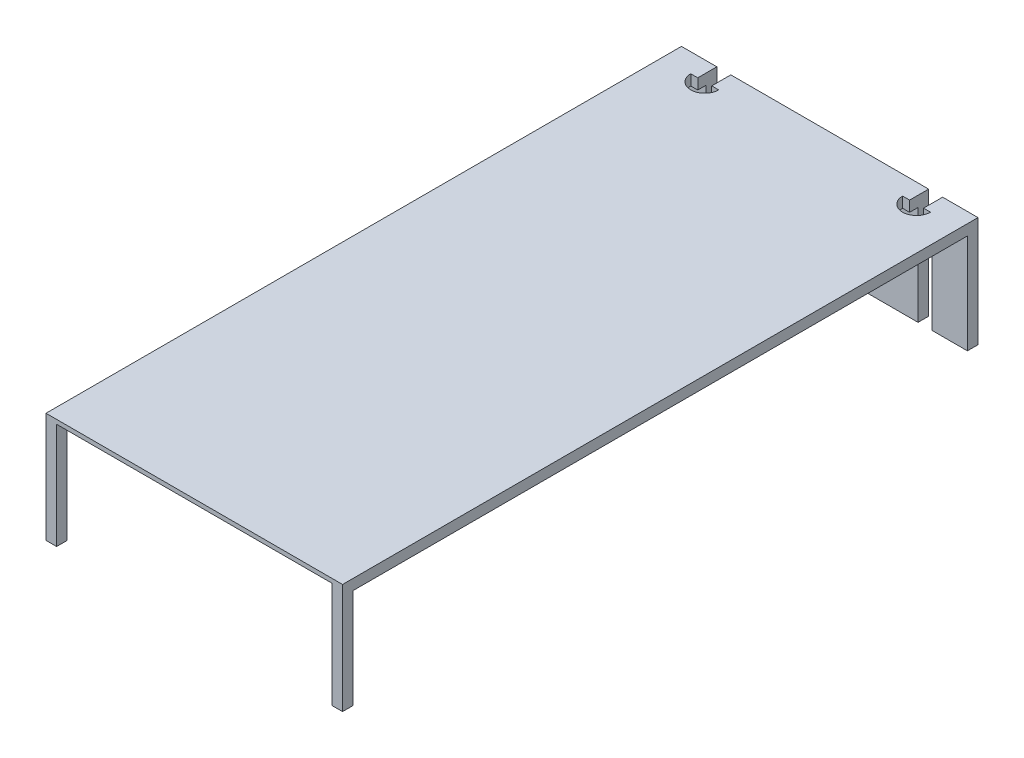
ISO-10303-21;
HEADER;
FILE_DESCRIPTION(('STEP AP214'),'2;1');
FILE_NAME('part.step','',(''),(''),'','','');
FILE_SCHEMA(('AUTOMOTIVE_DESIGN { 1 0 10303 214 1 1 1 1 }'));
ENDSEC;
DATA;
#1=APPLICATION_CONTEXT('core data for automotive mechanical design processes');
#2=APPLICATION_PROTOCOL_DEFINITION('international standard','automotive_design',2000,#1);
#3=PRODUCT_CONTEXT('',#1,'mechanical');
#4=PRODUCT('Part','Part','',(#3));
#5=PRODUCT_RELATED_PRODUCT_CATEGORY('part','',(#4));
#6=PRODUCT_DEFINITION_FORMATION('','',#4);
#7=PRODUCT_DEFINITION_CONTEXT('part definition',#1,'design');
#8=PRODUCT_DEFINITION('design','',#6,#7);
#9=PRODUCT_DEFINITION_SHAPE('','',#8);
#10=(LENGTH_UNIT() NAMED_UNIT(*) SI_UNIT(.MILLI.,.METRE.));
#11=(NAMED_UNIT(*) PLANE_ANGLE_UNIT() SI_UNIT($,.RADIAN.));
#12=(NAMED_UNIT(*) SI_UNIT($,.STERADIAN.) SOLID_ANGLE_UNIT());
#13=UNCERTAINTY_MEASURE_WITH_UNIT(LENGTH_MEASURE(1.E-05),#10,'distance_accuracy_value','');
#14=(GEOMETRIC_REPRESENTATION_CONTEXT(3) GLOBAL_UNCERTAINTY_ASSIGNED_CONTEXT((#13)) GLOBAL_UNIT_ASSIGNED_CONTEXT((#10,
#11,#12)) REPRESENTATION_CONTEXT('',''));
#15=CARTESIAN_POINT('',(0.,0.,0.));
#16=DIRECTION('',(0.,0.,1.));
#17=DIRECTION('',(1.,0.,0.));
#18=AXIS2_PLACEMENT_3D('',#15,#16,#17);
#19=CARTESIAN_POINT('',(0.,0.,0.));
#20=DIRECTION('',(0.,1.,0.));
#21=DIRECTION('',(0.,0.,1.));
#22=AXIS2_PLACEMENT_3D('',#19,#20,#21);
#23=PLANE('',#22);
#24=DIRECTION('',(0.,0.,-1.));
#25=VECTOR('',#24,1.);
#26=CARTESIAN_POINT('',(-32.5,0.,75.000012));
#27=LINE('',#26,#25);
#28=CARTESIAN_POINT('',(-32.5,0.,75.));
#29=VERTEX_POINT('',#28);
#30=CARTESIAN_POINT('',(-32.5,0.,72.5));
#31=VERTEX_POINT('',#30);
#32=EDGE_CURVE('E277',#29,#31,#27,.T.);
#33=ORIENTED_EDGE('',*,*,#32,.F.);
#34=DIRECTION('',(1.,0.,0.));
#35=VECTOR('',#34,1.);
#36=CARTESIAN_POINT('',(0.,0.,75.));
#37=LINE('',#36,#35);
#38=CARTESIAN_POINT('',(-35.,0.,75.));
#39=VERTEX_POINT('',#38);
#40=EDGE_CURVE('E451',#39,#29,#37,.T.);
#41=ORIENTED_EDGE('',*,*,#40,.F.);
#42=DIRECTION('',(0.,0.,1.));
#43=VECTOR('',#42,1.);
#44=CARTESIAN_POINT('',(-35.,0.,0.));
#45=LINE('',#44,#43);
#46=CARTESIAN_POINT('',(-35.,0.,72.5));
#47=VERTEX_POINT('',#46);
#48=EDGE_CURVE('E450',#47,#39,#45,.T.);
#49=ORIENTED_EDGE('',*,*,#48,.F.);
#50=DIRECTION('',(1.,0.,0.));
#51=VECTOR('',#50,1.);
#52=CARTESIAN_POINT('',(-35.,0.,72.5));
#53=LINE('',#52,#51);
#54=EDGE_CURVE('E316',#47,#31,#53,.T.);
#55=ORIENTED_EDGE('',*,*,#54,.T.);
#56=EDGE_LOOP('',(#33,#41,#49,#55));
#57=FACE_BOUND('',#56,.T.);
#58=ADVANCED_FACE('F47',(#57),#23,.F.);
#59=DIRECTION('',(0.,0.,-1.));
#60=VECTOR('',#59,1.);
#61=CARTESIAN_POINT('',(32.5,0.,75.000012));
#62=LINE('',#61,#60);
#63=CARTESIAN_POINT('',(32.5,0.,75.));
#64=VERTEX_POINT('',#63);
#65=CARTESIAN_POINT('',(32.5,0.,72.5));
#66=VERTEX_POINT('',#65);
#67=EDGE_CURVE('E253',#64,#66,#62,.T.);
#68=ORIENTED_EDGE('',*,*,#67,.T.);
#69=CARTESIAN_POINT('',(35.,0.,72.5));
#70=VERTEX_POINT('',#69);
#71=EDGE_CURVE('E300',#66,#70,#53,.T.);
#72=ORIENTED_EDGE('',*,*,#71,.T.);
#73=DIRECTION('',(0.,0.,1.));
#74=VECTOR('',#73,1.);
#75=CARTESIAN_POINT('',(35.,0.,0.));
#76=LINE('',#75,#74);
#77=CARTESIAN_POINT('',(35.,0.,75.));
#78=VERTEX_POINT('',#77);
#79=EDGE_CURVE('E455',#70,#78,#76,.T.);
#80=ORIENTED_EDGE('',*,*,#79,.T.);
#81=EDGE_CURVE('E449',#64,#78,#37,.T.);
#82=ORIENTED_EDGE('',*,*,#81,.F.);
#83=EDGE_LOOP('',(#68,#72,#80,#82));
#84=FACE_BOUND('',#83,.T.);
#85=ADVANCED_FACE('F559',(#84),#23,.F.);
#86=CARTESIAN_POINT('',(0.,26.,75.));
#87=DIRECTION('',(0.,0.,-1.));
#88=DIRECTION('',(-1.,0.,0.));
#89=AXIS2_PLACEMENT_3D('',#86,#87,#88);
#90=PLANE('',#89);
#91=DIRECTION('',(0.,-1.,0.));
#92=VECTOR('',#91,1.);
#93=CARTESIAN_POINT('',(-32.5,26.,75.));
#94=LINE('',#93,#92);
#95=CARTESIAN_POINT('',(-32.5,25.,75.));
#96=VERTEX_POINT('',#95);
#97=EDGE_CURVE('E287',#96,#29,#94,.T.);
#98=ORIENTED_EDGE('',*,*,#97,.F.);
#99=DIRECTION('',(-1.,0.,0.));
#100=VECTOR('',#99,1.);
#101=CARTESIAN_POINT('',(0.,25.,75.));
#102=LINE('',#101,#100);
#103=CARTESIAN_POINT('',(32.5,25.,75.));
#104=VERTEX_POINT('',#103);
#105=EDGE_CURVE('E11',#104,#96,#102,.T.);
#106=ORIENTED_EDGE('',*,*,#105,.F.);
#107=DIRECTION('',(0.,1.,0.));
#108=VECTOR('',#107,1.);
#109=CARTESIAN_POINT('',(32.5,26.,75.));
#110=LINE('',#109,#108);
#111=EDGE_CURVE('E248',#64,#104,#110,.T.);
#112=ORIENTED_EDGE('',*,*,#111,.F.);
#113=ORIENTED_EDGE('',*,*,#81,.T.);
#114=DIRECTION('',(0.,-1.,0.));
#115=VECTOR('',#114,1.);
#116=CARTESIAN_POINT('',(35.,26.,75.));
#117=LINE('',#116,#115);
#118=CARTESIAN_POINT('',(35.,26.,75.));
#119=VERTEX_POINT('',#118);
#120=EDGE_CURVE('E472',#119,#78,#117,.T.);
#121=ORIENTED_EDGE('',*,*,#120,.F.);
#122=DIRECTION('',(1.,0.,0.));
#123=VECTOR('',#122,1.);
#124=CARTESIAN_POINT('',(0.,26.,75.));
#125=LINE('',#124,#123);
#126=CARTESIAN_POINT('',(-35.,26.,75.));
#127=VERTEX_POINT('',#126);
#128=EDGE_CURVE('E419',#127,#119,#125,.T.);
#129=ORIENTED_EDGE('',*,*,#128,.F.);
#130=DIRECTION('',(0.,-1.,0.));
#131=VECTOR('',#130,1.);
#132=CARTESIAN_POINT('',(-35.,26.,75.));
#133=LINE('',#132,#131);
#134=EDGE_CURVE('E476',#127,#39,#133,.T.);
#135=ORIENTED_EDGE('',*,*,#134,.T.);
#136=ORIENTED_EDGE('',*,*,#40,.T.);
#137=EDGE_LOOP('',(#98,#106,#112,#113,#121,#129,#135,#136));
#138=FACE_BOUND('',#137,.T.);
#139=ADVANCED_FACE('F574',(#138),#90,.F.);
#140=CARTESIAN_POINT('',(-35.,23.5,72.5));
#141=DIRECTION('',(0.,1.,0.));
#142=DIRECTION('',(0.,0.,1.));
#143=AXIS2_PLACEMENT_3D('',#140,#141,#142);
#144=PLANE('',#143);
#145=DIRECTION('',(0.,0.,-1.));
#146=VECTOR('',#145,1.);
#147=CARTESIAN_POINT('',(-32.5,23.5,72.5));
#148=LINE('',#147,#146);
#149=CARTESIAN_POINT('',(-32.5,23.5,72.5));
#150=VERTEX_POINT('',#149);
#151=CARTESIAN_POINT('',(-32.5,23.5,49.));
#152=VERTEX_POINT('',#151);
#153=EDGE_CURVE('E284',#150,#152,#148,.T.);
#154=ORIENTED_EDGE('',*,*,#153,.F.);
#155=DIRECTION('',(1.,0.,0.));
#156=VECTOR('',#155,1.);
#157=CARTESIAN_POINT('',(-35.,23.5,72.5));
#158=LINE('',#157,#156);
#159=CARTESIAN_POINT('',(-35.,23.5,72.5));
#160=VERTEX_POINT('',#159);
#161=EDGE_CURVE('E301',#160,#150,#158,.T.);
#162=ORIENTED_EDGE('',*,*,#161,.F.);
#163=DIRECTION('',(0.,0.,1.));
#164=VECTOR('',#163,1.);
#165=CARTESIAN_POINT('',(-35.,23.5,72.5));
#166=LINE('',#165,#164);
#167=CARTESIAN_POINT('',(-35.,23.5,-72.5));
#168=VERTEX_POINT('',#167);
#169=EDGE_CURVE('E296',#168,#160,#166,.T.);
#170=ORIENTED_EDGE('',*,*,#169,.F.);
#171=DIRECTION('',(1.,0.,0.));
#172=VECTOR('',#171,1.);
#173=CARTESIAN_POINT('',(-35.,23.5,-72.5));
#174=LINE('',#173,#172);
#175=CARTESIAN_POINT('',(-26.65,23.5,-72.5));
#176=VERTEX_POINT('',#175);
#177=EDGE_CURVE('E307',#168,#176,#174,.T.);
#178=ORIENTED_EDGE('',*,*,#177,.T.);
#179=DIRECTION('',(0.,0.,1.));
#180=VECTOR('',#179,1.);
#181=CARTESIAN_POINT('',(-26.6500000000001,23.5,0.));
#182=LINE('',#181,#180);
#183=CARTESIAN_POINT('',(-26.65,23.5,-70.5));
#184=VERTEX_POINT('',#183);
#185=EDGE_CURVE('E360',#176,#184,#182,.T.);
#186=ORIENTED_EDGE('',*,*,#185,.T.);
#187=DIRECTION('',(-1.,0.,0.));
#188=VECTOR('',#187,1.);
#189=CARTESIAN_POINT('',(0.,23.5,-70.5));
#190=LINE('',#189,#188);
#191=CARTESIAN_POINT('',(-28.3,23.5,-70.5));
#192=VERTEX_POINT('',#191);
#193=EDGE_CURVE('E363',#184,#192,#190,.T.);
#194=ORIENTED_EDGE('',*,*,#193,.T.);
#195=CARTESIAN_POINT('',(-25.,23.5,-70.5));
#196=DIRECTION('',(0.,1.,0.));
#197=DIRECTION('',(0.,0.,1.));
#198=AXIS2_PLACEMENT_3D('',#195,#196,#197);
#199=CIRCLE('',#198,3.3);
#200=CARTESIAN_POINT('',(-21.7,23.5,-70.5));
#201=VERTEX_POINT('',#200);
#202=EDGE_CURVE('E366',#192,#201,#199,.T.);
#203=ORIENTED_EDGE('',*,*,#202,.T.);
#204=DIRECTION('',(-1.,0.,0.));
#205=VECTOR('',#204,1.);
#206=CARTESIAN_POINT('',(0.,23.5,-70.5));
#207=LINE('',#206,#205);
#208=CARTESIAN_POINT('',(-23.35,23.5,-70.5));
#209=VERTEX_POINT('',#208);
#210=EDGE_CURVE('E369',#201,#209,#207,.T.);
#211=ORIENTED_EDGE('',*,*,#210,.T.);
#212=DIRECTION('',(0.,0.,-1.));
#213=VECTOR('',#212,1.);
#214=CARTESIAN_POINT('',(-23.35,23.5,0.));
#215=LINE('',#214,#213);
#216=CARTESIAN_POINT('',(-23.35,23.5,-72.5));
#217=VERTEX_POINT('',#216);
#218=EDGE_CURVE('E372',#209,#217,#215,.T.);
#219=ORIENTED_EDGE('',*,*,#218,.T.);
#220=CARTESIAN_POINT('',(23.35,23.5,-72.5));
#221=VERTEX_POINT('',#220);
#222=EDGE_CURVE('E311',#217,#221,#174,.T.);
#223=ORIENTED_EDGE('',*,*,#222,.T.);
#224=DIRECTION('',(0.,0.,-1.));
#225=VECTOR('',#224,1.);
#226=CARTESIAN_POINT('',(23.35,23.5,0.));
#227=LINE('',#226,#225);
#228=CARTESIAN_POINT('',(23.35,23.5,-70.5));
#229=VERTEX_POINT('',#228);
#230=EDGE_CURVE('E352',#229,#221,#227,.T.);
#231=ORIENTED_EDGE('',*,*,#230,.F.);
#232=DIRECTION('',(1.,0.,0.));
#233=VECTOR('',#232,1.);
#234=CARTESIAN_POINT('',(0.,23.5,-70.5));
#235=LINE('',#234,#233);
#236=CARTESIAN_POINT('',(21.7,23.5,-70.5));
#237=VERTEX_POINT('',#236);
#238=EDGE_CURVE('E348',#237,#229,#235,.T.);
#239=ORIENTED_EDGE('',*,*,#238,.F.);
#240=CARTESIAN_POINT('',(25.,23.5,-70.5));
#241=DIRECTION('',(0.,1.,0.));
#242=DIRECTION('',(0.,0.,1.));
#243=AXIS2_PLACEMENT_3D('',#240,#241,#242);
#244=CIRCLE('',#243,3.3);
#245=CARTESIAN_POINT('',(28.3,23.5,-70.5));
#246=VERTEX_POINT('',#245);
#247=EDGE_CURVE('E344',#246,#237,#244,.F.);
#248=ORIENTED_EDGE('',*,*,#247,.F.);
#249=DIRECTION('',(1.,0.,0.));
#250=VECTOR('',#249,1.);
#251=CARTESIAN_POINT('',(0.,23.5,-70.5));
#252=LINE('',#251,#250);
#253=CARTESIAN_POINT('',(26.65,23.5,-70.5));
#254=VERTEX_POINT('',#253);
#255=EDGE_CURVE('E340',#254,#246,#252,.T.);
#256=ORIENTED_EDGE('',*,*,#255,.F.);
#257=DIRECTION('',(0.,0.,1.));
#258=VECTOR('',#257,1.);
#259=CARTESIAN_POINT('',(26.6500000000001,23.5,0.));
#260=LINE('',#259,#258);
#261=CARTESIAN_POINT('',(26.65,23.5,-72.5));
#262=VERTEX_POINT('',#261);
#263=EDGE_CURVE('E527',#262,#254,#260,.T.);
#264=ORIENTED_EDGE('',*,*,#263,.F.);
#265=CARTESIAN_POINT('',(35.,23.5,-72.5));
#266=VERTEX_POINT('',#265);
#267=EDGE_CURVE('E312',#262,#266,#174,.T.);
#268=ORIENTED_EDGE('',*,*,#267,.T.);
#269=DIRECTION('',(0.,0.,1.));
#270=VECTOR('',#269,1.);
#271=CARTESIAN_POINT('',(35.,23.5,0.));
#272=LINE('',#271,#270);
#273=CARTESIAN_POINT('',(35.,23.5,72.5));
#274=VERTEX_POINT('',#273);
#275=EDGE_CURVE('E356',#266,#274,#272,.T.);
#276=ORIENTED_EDGE('',*,*,#275,.T.);
#277=CARTESIAN_POINT('',(32.5,23.5,72.5));
#278=VERTEX_POINT('',#277);
#279=EDGE_CURVE('E306',#278,#274,#158,.T.);
#280=ORIENTED_EDGE('',*,*,#279,.F.);
#281=DIRECTION('',(0.,0.,1.));
#282=VECTOR('',#281,1.);
#283=CARTESIAN_POINT('',(32.5,23.5,72.5));
#284=LINE('',#283,#282);
#285=CARTESIAN_POINT('',(32.5,23.5,49.));
#286=VERTEX_POINT('',#285);
#287=EDGE_CURVE('E63',#286,#278,#284,.T.);
#288=ORIENTED_EDGE('',*,*,#287,.F.);
#289=DIRECTION('',(1.,0.,0.));
#290=VECTOR('',#289,1.);
#291=CARTESIAN_POINT('',(-35.,23.5,49.));
#292=LINE('',#291,#290);
#293=EDGE_CURVE('E56',#152,#286,#292,.T.);
#294=ORIENTED_EDGE('',*,*,#293,.F.);
#295=EDGE_LOOP('',(#154,#162,#170,#178,#186,#194,#203,#211,#219,#223,#231,#239,#248,#256,#264,
#268,#276,#280,#288,#294));
#296=FACE_BOUND('',#295,.T.);
#297=ADVANCED_FACE('F581',(#296),#144,.F.);
#298=CARTESIAN_POINT('',(-35.,23.5,72.5));
#299=DIRECTION('',(0.,0.,1.));
#300=DIRECTION('',(1.,0.,0.));
#301=AXIS2_PLACEMENT_3D('',#298,#299,#300);
#302=PLANE('',#301);
#303=DIRECTION('',(0.,1.,0.));
#304=VECTOR('',#303,1.);
#305=CARTESIAN_POINT('',(-32.5,23.5,72.5));
#306=LINE('',#305,#304);
#307=EDGE_CURVE('E534',#31,#150,#306,.T.);
#308=ORIENTED_EDGE('',*,*,#307,.F.);
#309=ORIENTED_EDGE('',*,*,#54,.F.);
#310=DIRECTION('',(0.,-1.,0.));
#311=VECTOR('',#310,1.);
#312=CARTESIAN_POINT('',(-35.,23.5,72.5));
#313=LINE('',#312,#311);
#314=EDGE_CURVE('E290',#160,#47,#313,.T.);
#315=ORIENTED_EDGE('',*,*,#314,.F.);
#316=ORIENTED_EDGE('',*,*,#161,.T.);
#317=EDGE_LOOP('',(#308,#309,#315,#316));
#318=FACE_BOUND('',#317,.T.);
#319=ADVANCED_FACE('F607',(#318),#302,.F.);
#320=DIRECTION('',(0.,-1.,0.));
#321=VECTOR('',#320,1.);
#322=CARTESIAN_POINT('',(32.5,23.5,72.5));
#323=LINE('',#322,#321);
#324=EDGE_CURVE('E531',#278,#66,#323,.T.);
#325=ORIENTED_EDGE('',*,*,#324,.F.);
#326=ORIENTED_EDGE('',*,*,#279,.T.);
#327=DIRECTION('',(0.,-1.,0.));
#328=VECTOR('',#327,1.);
#329=CARTESIAN_POINT('',(35.,26.,72.5));
#330=LINE('',#329,#328);
#331=EDGE_CURVE('E336',#274,#70,#330,.T.);
#332=ORIENTED_EDGE('',*,*,#331,.T.);
#333=ORIENTED_EDGE('',*,*,#71,.F.);
#334=EDGE_LOOP('',(#325,#326,#332,#333));
#335=FACE_BOUND('',#334,.T.);
#336=ADVANCED_FACE('F564',(#335),#302,.F.);
#337=CARTESIAN_POINT('',(35.,0.,-75.));
#338=VERTEX_POINT('',#337);
#339=CARTESIAN_POINT('',(35.,0.,-72.5));
#340=VERTEX_POINT('',#339);
#341=EDGE_CURVE('E456',#338,#340,#76,.T.);
#342=ORIENTED_EDGE('',*,*,#341,.T.);
#343=DIRECTION('',(-1.,0.,0.));
#344=VECTOR('',#343,1.);
#345=CARTESIAN_POINT('',(0.,0.,-72.5));
#346=LINE('',#345,#344);
#347=CARTESIAN_POINT('',(26.65,0.,-72.5));
#348=VERTEX_POINT('',#347);
#349=EDGE_CURVE('E523',#340,#348,#346,.T.);
#350=ORIENTED_EDGE('',*,*,#349,.T.);
#351=DIRECTION('',(0.,0.,1.));
#352=VECTOR('',#351,1.);
#353=CARTESIAN_POINT('',(26.6500000000001,0.,0.));
#354=LINE('',#353,#352);
#355=CARTESIAN_POINT('',(26.65,0.,-75.));
#356=VERTEX_POINT('',#355);
#357=EDGE_CURVE('E381',#356,#348,#354,.T.);
#358=ORIENTED_EDGE('',*,*,#357,.F.);
#359=DIRECTION('',(1.,0.,0.));
#360=VECTOR('',#359,1.);
#361=CARTESIAN_POINT('',(0.,0.,-75.));
#362=LINE('',#361,#360);
#363=EDGE_CURVE('E437',#356,#338,#362,.T.);
#364=ORIENTED_EDGE('',*,*,#363,.T.);
#365=EDGE_LOOP('',(#342,#350,#358,#364));
#366=FACE_BOUND('',#365,.T.);
#367=ADVANCED_FACE('F587',(#366),#23,.F.);
#368=DIRECTION('',(0.,0.,-1.));
#369=VECTOR('',#368,1.);
#370=CARTESIAN_POINT('',(23.35,0.,0.));
#371=LINE('',#370,#369);
#372=CARTESIAN_POINT('',(23.35,0.,-72.5));
#373=VERTEX_POINT('',#372);
#374=CARTESIAN_POINT('',(23.35,0.,-75.));
#375=VERTEX_POINT('',#374);
#376=EDGE_CURVE('E375',#373,#375,#371,.T.);
#377=ORIENTED_EDGE('',*,*,#376,.F.);
#378=CARTESIAN_POINT('',(-23.35,0.,-72.5));
#379=VERTEX_POINT('',#378);
#380=EDGE_CURVE('E522',#373,#379,#346,.T.);
#381=ORIENTED_EDGE('',*,*,#380,.T.);
#382=DIRECTION('',(0.,0.,-1.));
#383=VECTOR('',#382,1.);
#384=CARTESIAN_POINT('',(-23.35,0.,0.));
#385=LINE('',#384,#383);
#386=CARTESIAN_POINT('',(-23.35,0.,-75.));
#387=VERTEX_POINT('',#386);
#388=EDGE_CURVE('E436',#379,#387,#385,.T.);
#389=ORIENTED_EDGE('',*,*,#388,.T.);
#390=EDGE_CURVE('E432',#387,#375,#362,.T.);
#391=ORIENTED_EDGE('',*,*,#390,.T.);
#392=EDGE_LOOP('',(#377,#381,#389,#391));
#393=FACE_BOUND('',#392,.T.);
#394=ADVANCED_FACE('F643',(#393),#23,.F.);
#395=CARTESIAN_POINT('',(0.,26.,-70.5));
#396=DIRECTION('',(0.,0.,-1.));
#397=DIRECTION('',(-1.,0.,0.));
#398=AXIS2_PLACEMENT_3D('',#395,#396,#397);
#399=PLANE('',#398);
#400=DIRECTION('',(0.,-1.,0.));
#401=VECTOR('',#400,1.);
#402=CARTESIAN_POINT('',(26.65,26.,-70.5));
#403=LINE('',#402,#401);
#404=CARTESIAN_POINT('',(26.65,26.,-70.5));
#405=VERTEX_POINT('',#404);
#406=EDGE_CURVE('E429',#405,#254,#403,.T.);
#407=ORIENTED_EDGE('',*,*,#406,.T.);
#408=ORIENTED_EDGE('',*,*,#255,.T.);
#409=DIRECTION('',(0.,-1.,0.));
#410=VECTOR('',#409,1.);
#411=CARTESIAN_POINT('',(28.3,26.,-70.5));
#412=LINE('',#411,#410);
#413=CARTESIAN_POINT('',(28.3,26.,-70.5));
#414=VERTEX_POINT('',#413);
#415=EDGE_CURVE('E518',#414,#246,#412,.T.);
#416=ORIENTED_EDGE('',*,*,#415,.F.);
#417=DIRECTION('',(1.,0.,0.));
#418=VECTOR('',#417,1.);
#419=CARTESIAN_POINT('',(0.,26.,-70.5));
#420=LINE('',#419,#418);
#421=EDGE_CURVE('E376',#405,#414,#420,.T.);
#422=ORIENTED_EDGE('',*,*,#421,.F.);
#423=EDGE_LOOP('',(#407,#408,#416,#422));
#424=FACE_BOUND('',#423,.T.);
#425=ADVANCED_FACE('F49',(#424),#399,.F.);
#426=CARTESIAN_POINT('',(25.,26.,-70.5));
#427=DIRECTION('',(0.,-1.,0.));
#428=DIRECTION('',(0.,0.,-1.));
#429=AXIS2_PLACEMENT_3D('',#426,#427,#428);
#430=CYLINDRICAL_SURFACE('',#429,3.3);
#431=ORIENTED_EDGE('',*,*,#415,.T.);
#432=ORIENTED_EDGE('',*,*,#247,.T.);
#433=DIRECTION('',(0.,-1.,0.));
#434=VECTOR('',#433,1.);
#435=CARTESIAN_POINT('',(21.7,26.,-70.5));
#436=LINE('',#435,#434);
#437=CARTESIAN_POINT('',(21.7,26.,-70.5));
#438=VERTEX_POINT('',#437);
#439=EDGE_CURVE('E514',#438,#237,#436,.T.);
#440=ORIENTED_EDGE('',*,*,#439,.F.);
#441=CARTESIAN_POINT('',(25.,26.,-70.5));
#442=DIRECTION('',(0.,1.,0.));
#443=DIRECTION('',(0.,0.,1.));
#444=AXIS2_PLACEMENT_3D('',#441,#442,#443);
#445=CIRCLE('',#444,3.3);
#446=EDGE_CURVE('E380',#414,#438,#445,.F.);
#447=ORIENTED_EDGE('',*,*,#446,.F.);
#448=EDGE_LOOP('',(#431,#432,#440,#447));
#449=FACE_BOUND('',#448,.T.);
#450=ADVANCED_FACE('F655',(#449),#430,.F.);
#451=CARTESIAN_POINT('',(0.,26.,-70.5));
#452=DIRECTION('',(0.,0.,-1.));
#453=DIRECTION('',(-1.,0.,0.));
#454=AXIS2_PLACEMENT_3D('',#451,#452,#453);
#455=PLANE('',#454);
#456=ORIENTED_EDGE('',*,*,#439,.T.);
#457=ORIENTED_EDGE('',*,*,#238,.T.);
#458=DIRECTION('',(0.,-1.,0.));
#459=VECTOR('',#458,1.);
#460=CARTESIAN_POINT('',(23.35,26.,-70.5));
#461=LINE('',#460,#459);
#462=CARTESIAN_POINT('',(23.35,26.,-70.5));
#463=VERTEX_POINT('',#462);
#464=EDGE_CURVE('E510',#463,#229,#461,.T.);
#465=ORIENTED_EDGE('',*,*,#464,.F.);
#466=DIRECTION('',(1.,0.,0.));
#467=VECTOR('',#466,1.);
#468=CARTESIAN_POINT('',(0.,26.,-70.5));
#469=LINE('',#468,#467);
#470=EDGE_CURVE('E384',#438,#463,#469,.T.);
#471=ORIENTED_EDGE('',*,*,#470,.F.);
#472=EDGE_LOOP('',(#456,#457,#465,#471));
#473=FACE_BOUND('',#472,.T.);
#474=ADVANCED_FACE('F688',(#473),#455,.F.);
#475=CARTESIAN_POINT('',(23.35,26.,0.));
#476=DIRECTION('',(-1.,0.,0.));
#477=DIRECTION('',(0.,0.,1.));
#478=AXIS2_PLACEMENT_3D('',#475,#476,#477);
#479=PLANE('',#478);
#480=ORIENTED_EDGE('',*,*,#464,.T.);
#481=ORIENTED_EDGE('',*,*,#230,.T.);
#482=DIRECTION('',(0.,-1.,0.));
#483=VECTOR('',#482,1.);
#484=CARTESIAN_POINT('',(23.35,26.,-72.5));
#485=LINE('',#484,#483);
#486=EDGE_CURVE('E332',#221,#373,#485,.T.);
#487=ORIENTED_EDGE('',*,*,#486,.T.);
#488=ORIENTED_EDGE('',*,*,#376,.T.);
#489=DIRECTION('',(0.,-1.,0.));
#490=VECTOR('',#489,1.);
#491=CARTESIAN_POINT('',(23.35,26.,-75.));
#492=LINE('',#491,#490);
#493=CARTESIAN_POINT('',(23.35,26.,-75.));
#494=VERTEX_POINT('',#493);
#495=EDGE_CURVE('E506',#494,#375,#492,.T.);
#496=ORIENTED_EDGE('',*,*,#495,.F.);
#497=DIRECTION('',(0.,0.,-1.));
#498=VECTOR('',#497,1.);
#499=CARTESIAN_POINT('',(23.35,26.,0.));
#500=LINE('',#499,#498);
#501=EDGE_CURVE('E387',#463,#494,#500,.T.);
#502=ORIENTED_EDGE('',*,*,#501,.F.);
#503=EDGE_LOOP('',(#480,#481,#487,#488,#496,#502));
#504=FACE_BOUND('',#503,.T.);
#505=ADVANCED_FACE('F662',(#504),#479,.F.);
#506=CARTESIAN_POINT('',(0.,26.,-75.));
#507=DIRECTION('',(0.,0.,-1.));
#508=DIRECTION('',(-1.,0.,0.));
#509=AXIS2_PLACEMENT_3D('',#506,#507,#508);
#510=PLANE('',#509);
#511=ORIENTED_EDGE('',*,*,#390,.F.);
#512=DIRECTION('',(0.,-1.,0.));
#513=VECTOR('',#512,1.);
#514=CARTESIAN_POINT('',(-23.35,26.,-75.));
#515=LINE('',#514,#513);
#516=CARTESIAN_POINT('',(-23.35,26.,-75.));
#517=VERTEX_POINT('',#516);
#518=EDGE_CURVE('E502',#517,#387,#515,.T.);
#519=ORIENTED_EDGE('',*,*,#518,.F.);
#520=DIRECTION('',(1.,0.,0.));
#521=VECTOR('',#520,1.);
#522=CARTESIAN_POINT('',(0.,26.,-75.));
#523=LINE('',#522,#521);
#524=EDGE_CURVE('E390',#517,#494,#523,.T.);
#525=ORIENTED_EDGE('',*,*,#524,.T.);
#526=ORIENTED_EDGE('',*,*,#495,.T.);
#527=EDGE_LOOP('',(#511,#519,#525,#526));
#528=FACE_BOUND('',#527,.T.);
#529=ADVANCED_FACE('F665',(#528),#510,.T.);
#530=CARTESIAN_POINT('',(-23.35,26.,0.));
#531=DIRECTION('',(-1.,0.,0.));
#532=DIRECTION('',(0.,0.,1.));
#533=AXIS2_PLACEMENT_3D('',#530,#531,#532);
#534=PLANE('',#533);
#535=ORIENTED_EDGE('',*,*,#218,.F.);
#536=DIRECTION('',(0.,-1.,0.));
#537=VECTOR('',#536,1.);
#538=CARTESIAN_POINT('',(-23.35,26.,-70.5));
#539=LINE('',#538,#537);
#540=CARTESIAN_POINT('',(-23.35,26.,-70.5));
#541=VERTEX_POINT('',#540);
#542=EDGE_CURVE('E498',#541,#209,#539,.T.);
#543=ORIENTED_EDGE('',*,*,#542,.F.);
#544=DIRECTION('',(0.,0.,-1.));
#545=VECTOR('',#544,1.);
#546=CARTESIAN_POINT('',(-23.35,26.,0.));
#547=LINE('',#546,#545);
#548=EDGE_CURVE('E394',#541,#517,#547,.T.);
#549=ORIENTED_EDGE('',*,*,#548,.T.);
#550=ORIENTED_EDGE('',*,*,#518,.T.);
#551=ORIENTED_EDGE('',*,*,#388,.F.);
#552=DIRECTION('',(0.,-1.,0.));
#553=VECTOR('',#552,1.);
#554=CARTESIAN_POINT('',(-23.35,26.,-72.5));
#555=LINE('',#554,#553);
#556=EDGE_CURVE('E329',#217,#379,#555,.T.);
#557=ORIENTED_EDGE('',*,*,#556,.F.);
#558=EDGE_LOOP('',(#535,#543,#549,#550,#551,#557));
#559=FACE_BOUND('',#558,.T.);
#560=ADVANCED_FACE('F671',(#559),#534,.T.);
#561=CARTESIAN_POINT('',(0.,26.,-70.5));
#562=DIRECTION('',(0.,0.,1.));
#563=DIRECTION('',(1.,0.,0.));
#564=AXIS2_PLACEMENT_3D('',#561,#562,#563);
#565=PLANE('',#564);
#566=ORIENTED_EDGE('',*,*,#210,.F.);
#567=DIRECTION('',(0.,-1.,0.));
#568=VECTOR('',#567,1.);
#569=CARTESIAN_POINT('',(-21.7,26.,-70.5));
#570=LINE('',#569,#568);
#571=CARTESIAN_POINT('',(-21.7,26.,-70.5));
#572=VERTEX_POINT('',#571);
#573=EDGE_CURVE('E494',#572,#201,#570,.T.);
#574=ORIENTED_EDGE('',*,*,#573,.F.);
#575=DIRECTION('',(-1.,0.,0.));
#576=VECTOR('',#575,1.);
#577=CARTESIAN_POINT('',(0.,26.,-70.5));
#578=LINE('',#577,#576);
#579=EDGE_CURVE('E400',#572,#541,#578,.T.);
#580=ORIENTED_EDGE('',*,*,#579,.T.);
#581=ORIENTED_EDGE('',*,*,#542,.T.);
#582=EDGE_LOOP('',(#566,#574,#580,#581));
#583=FACE_BOUND('',#582,.T.);
#584=ADVANCED_FACE('F675',(#583),#565,.T.);
#585=CARTESIAN_POINT('',(-25.,26.,-70.5));
#586=DIRECTION('',(0.,-1.,0.));
#587=DIRECTION('',(0.,0.,-1.));
#588=AXIS2_PLACEMENT_3D('',#585,#586,#587);
#589=CYLINDRICAL_SURFACE('',#588,3.3);
#590=ORIENTED_EDGE('',*,*,#202,.F.);
#591=DIRECTION('',(0.,-1.,0.));
#592=VECTOR('',#591,1.);
#593=CARTESIAN_POINT('',(-28.3,26.,-70.5));
#594=LINE('',#593,#592);
#595=CARTESIAN_POINT('',(-28.3,26.,-70.5));
#596=VERTEX_POINT('',#595);
#597=EDGE_CURVE('E490',#596,#192,#594,.T.);
#598=ORIENTED_EDGE('',*,*,#597,.F.);
#599=CARTESIAN_POINT('',(-25.,26.,-70.5));
#600=DIRECTION('',(0.,1.,0.));
#601=DIRECTION('',(0.,0.,1.));
#602=AXIS2_PLACEMENT_3D('',#599,#600,#601);
#603=CIRCLE('',#602,3.3);
#604=EDGE_CURVE('E404',#596,#572,#603,.T.);
#605=ORIENTED_EDGE('',*,*,#604,.T.);
#606=ORIENTED_EDGE('',*,*,#573,.T.);
#607=EDGE_LOOP('',(#590,#598,#605,#606));
#608=FACE_BOUND('',#607,.T.);
#609=ADVANCED_FACE('F680',(#608),#589,.F.);
#610=CARTESIAN_POINT('',(0.,26.,-70.5));
#611=DIRECTION('',(0.,0.,1.));
#612=DIRECTION('',(1.,0.,0.));
#613=AXIS2_PLACEMENT_3D('',#610,#611,#612);
#614=PLANE('',#613);
#615=ORIENTED_EDGE('',*,*,#193,.F.);
#616=DIRECTION('',(0.,-1.,0.));
#617=VECTOR('',#616,1.);
#618=CARTESIAN_POINT('',(-26.65,26.,-70.5));
#619=LINE('',#618,#617);
#620=CARTESIAN_POINT('',(-26.65,26.,-70.5));
#621=VERTEX_POINT('',#620);
#622=EDGE_CURVE('E486',#621,#184,#619,.T.);
#623=ORIENTED_EDGE('',*,*,#622,.F.);
#624=DIRECTION('',(-1.,0.,0.));
#625=VECTOR('',#624,1.);
#626=CARTESIAN_POINT('',(0.,26.,-70.5));
#627=LINE('',#626,#625);
#628=EDGE_CURVE('E408',#621,#596,#627,.T.);
#629=ORIENTED_EDGE('',*,*,#628,.T.);
#630=ORIENTED_EDGE('',*,*,#597,.T.);
#631=EDGE_LOOP('',(#615,#623,#629,#630));
#632=FACE_BOUND('',#631,.T.);
#633=ADVANCED_FACE('F683',(#632),#614,.T.);
#634=CARTESIAN_POINT('',(-26.6500000000001,26.,0.));
#635=DIRECTION('',(1.,0.,0.));
#636=DIRECTION('',(0.,0.,-1.));
#637=AXIS2_PLACEMENT_3D('',#634,#635,#636);
#638=PLANE('',#637);
#639=ORIENTED_EDGE('',*,*,#185,.F.);
#640=DIRECTION('',(0.,1.,0.));
#641=VECTOR('',#640,1.);
#642=CARTESIAN_POINT('',(-26.65,26.,-72.5));
#643=LINE('',#642,#641);
#644=CARTESIAN_POINT('',(-26.65,0.,-72.5));
#645=VERTEX_POINT('',#644);
#646=EDGE_CURVE('E326',#645,#176,#643,.T.);
#647=ORIENTED_EDGE('',*,*,#646,.F.);
#648=DIRECTION('',(0.,0.,1.));
#649=VECTOR('',#648,1.);
#650=CARTESIAN_POINT('',(-26.6500000000001,0.,0.));
#651=LINE('',#650,#649);
#652=CARTESIAN_POINT('',(-26.65,0.,-75.));
#653=VERTEX_POINT('',#652);
#654=EDGE_CURVE('E441',#653,#645,#651,.T.);
#655=ORIENTED_EDGE('',*,*,#654,.F.);
#656=DIRECTION('',(0.,-1.,0.));
#657=VECTOR('',#656,1.);
#658=CARTESIAN_POINT('',(-26.65,26.,-75.));
#659=LINE('',#658,#657);
#660=CARTESIAN_POINT('',(-26.65,26.,-75.));
#661=VERTEX_POINT('',#660);
#662=EDGE_CURVE('E483',#661,#653,#659,.T.);
#663=ORIENTED_EDGE('',*,*,#662,.F.);
#664=DIRECTION('',(0.,0.,1.));
#665=VECTOR('',#664,1.);
#666=CARTESIAN_POINT('',(-26.6500000000001,26.,0.));
#667=LINE('',#666,#665);
#668=EDGE_CURVE('E412',#661,#621,#667,.T.);
#669=ORIENTED_EDGE('',*,*,#668,.T.);
#670=ORIENTED_EDGE('',*,*,#622,.T.);
#671=EDGE_LOOP('',(#639,#647,#655,#663,#669,#670));
#672=FACE_BOUND('',#671,.T.);
#673=ADVANCED_FACE('F620',(#672),#638,.T.);
#674=CARTESIAN_POINT('',(-35.,0.,-75.));
#675=VERTEX_POINT('',#674);
#676=EDGE_CURVE('E438',#675,#653,#362,.T.);
#677=ORIENTED_EDGE('',*,*,#676,.F.);
#678=DIRECTION('',(0.,-1.,0.));
#679=VECTOR('',#678,1.);
#680=CARTESIAN_POINT('',(-35.,26.,-75.));
#681=LINE('',#680,#679);
#682=CARTESIAN_POINT('',(-35.,26.,-75.));
#683=VERTEX_POINT('',#682);
#684=EDGE_CURVE('E480',#683,#675,#681,.T.);
#685=ORIENTED_EDGE('',*,*,#684,.F.);
#686=EDGE_CURVE('E396',#683,#661,#523,.T.);
#687=ORIENTED_EDGE('',*,*,#686,.T.);
#688=ORIENTED_EDGE('',*,*,#662,.T.);
#689=EDGE_LOOP('',(#677,#685,#687,#688));
#690=FACE_BOUND('',#689,.T.);
#691=ADVANCED_FACE('F616',(#690),#510,.T.);
#692=CARTESIAN_POINT('',(-35.,26.,0.));
#693=DIRECTION('',(1.,0.,0.));
#694=DIRECTION('',(0.,0.,-1.));
#695=AXIS2_PLACEMENT_3D('',#692,#693,#694);
#696=PLANE('',#695);
#697=ORIENTED_EDGE('',*,*,#169,.T.);
#698=ORIENTED_EDGE('',*,*,#314,.T.);
#699=ORIENTED_EDGE('',*,*,#48,.T.);
#700=ORIENTED_EDGE('',*,*,#134,.F.);
#701=DIRECTION('',(0.,0.,1.));
#702=VECTOR('',#701,1.);
#703=CARTESIAN_POINT('',(-35.,26.,0.));
#704=LINE('',#703,#702);
#705=EDGE_CURVE('E416',#683,#127,#704,.T.);
#706=ORIENTED_EDGE('',*,*,#705,.F.);
#707=ORIENTED_EDGE('',*,*,#684,.T.);
#708=CARTESIAN_POINT('',(-35.,0.,-72.5));
#709=VERTEX_POINT('',#708);
#710=EDGE_CURVE('E445',#675,#709,#45,.T.);
#711=ORIENTED_EDGE('',*,*,#710,.T.);
#712=DIRECTION('',(0.,1.,0.));
#713=VECTOR('',#712,1.);
#714=CARTESIAN_POINT('',(-35.,23.5,-72.5));
#715=LINE('',#714,#713);
#716=EDGE_CURVE('E71',#709,#168,#715,.T.);
#717=ORIENTED_EDGE('',*,*,#716,.T.);
#718=EDGE_LOOP('',(#697,#698,#699,#700,#706,#707,#711,#717));
#719=FACE_BOUND('',#718,.T.);
#720=ADVANCED_FACE('F601',(#719),#696,.F.);
#721=CARTESIAN_POINT('',(35.,26.,0.));
#722=DIRECTION('',(1.,0.,0.));
#723=DIRECTION('',(0.,0.,-1.));
#724=AXIS2_PLACEMENT_3D('',#721,#722,#723);
#725=PLANE('',#724);
#726=ORIENTED_EDGE('',*,*,#331,.F.);
#727=ORIENTED_EDGE('',*,*,#275,.F.);
#728=DIRECTION('',(0.,1.,0.));
#729=VECTOR('',#728,1.);
#730=CARTESIAN_POINT('',(35.,26.,-72.5));
#731=LINE('',#730,#729);
#732=EDGE_CURVE('E323',#340,#266,#731,.T.);
#733=ORIENTED_EDGE('',*,*,#732,.F.);
#734=ORIENTED_EDGE('',*,*,#341,.F.);
#735=DIRECTION('',(0.,-1.,0.));
#736=VECTOR('',#735,1.);
#737=CARTESIAN_POINT('',(35.,26.,-75.));
#738=LINE('',#737,#736);
#739=CARTESIAN_POINT('',(35.,26.,-75.));
#740=VERTEX_POINT('',#739);
#741=EDGE_CURVE('E469',#740,#338,#738,.T.);
#742=ORIENTED_EDGE('',*,*,#741,.F.);
#743=DIRECTION('',(0.,0.,1.));
#744=VECTOR('',#743,1.);
#745=CARTESIAN_POINT('',(35.,26.,0.));
#746=LINE('',#745,#744);
#747=EDGE_CURVE('E422',#740,#119,#746,.T.);
#748=ORIENTED_EDGE('',*,*,#747,.T.);
#749=ORIENTED_EDGE('',*,*,#120,.T.);
#750=ORIENTED_EDGE('',*,*,#79,.F.);
#751=EDGE_LOOP('',(#726,#727,#733,#734,#742,#748,#749,#750));
#752=FACE_BOUND('',#751,.T.);
#753=ADVANCED_FACE('F568',(#752),#725,.T.);
#754=ORIENTED_EDGE('',*,*,#363,.F.);
#755=DIRECTION('',(0.,-1.,0.));
#756=VECTOR('',#755,1.);
#757=CARTESIAN_POINT('',(26.65,26.,-75.));
#758=LINE('',#757,#756);
#759=CARTESIAN_POINT('',(26.65,26.,-75.));
#760=VERTEX_POINT('',#759);
#761=EDGE_CURVE('E466',#760,#356,#758,.T.);
#762=ORIENTED_EDGE('',*,*,#761,.F.);
#763=EDGE_CURVE('E395',#760,#740,#523,.T.);
#764=ORIENTED_EDGE('',*,*,#763,.T.);
#765=ORIENTED_EDGE('',*,*,#741,.T.);
#766=EDGE_LOOP('',(#754,#762,#764,#765));
#767=FACE_BOUND('',#766,.T.);
#768=ADVANCED_FACE('F591',(#767),#510,.T.);
#769=CARTESIAN_POINT('',(26.6500000000001,26.,0.));
#770=DIRECTION('',(1.,0.,0.));
#771=DIRECTION('',(0.,0.,-1.));
#772=AXIS2_PLACEMENT_3D('',#769,#770,#771);
#773=PLANE('',#772);
#774=DIRECTION('',(0.,1.,0.));
#775=VECTOR('',#774,1.);
#776=CARTESIAN_POINT('',(26.65,26.,-72.5));
#777=LINE('',#776,#775);
#778=EDGE_CURVE('E305',#348,#262,#777,.T.);
#779=ORIENTED_EDGE('',*,*,#778,.T.);
#780=ORIENTED_EDGE('',*,*,#263,.T.);
#781=ORIENTED_EDGE('',*,*,#406,.F.);
#782=DIRECTION('',(0.,0.,1.));
#783=VECTOR('',#782,1.);
#784=CARTESIAN_POINT('',(26.6500000000001,26.,0.));
#785=LINE('',#784,#783);
#786=EDGE_CURVE('E426',#760,#405,#785,.T.);
#787=ORIENTED_EDGE('',*,*,#786,.F.);
#788=ORIENTED_EDGE('',*,*,#761,.T.);
#789=ORIENTED_EDGE('',*,*,#357,.T.);
#790=EDGE_LOOP('',(#779,#780,#781,#787,#788,#789));
#791=FACE_BOUND('',#790,.T.);
#792=ADVANCED_FACE('F648',(#791),#773,.F.);
#793=CARTESIAN_POINT('',(0.,26.,0.));
#794=DIRECTION('',(0.,1.,0.));
#795=DIRECTION('',(0.,0.,1.));
#796=AXIS2_PLACEMENT_3D('',#793,#794,#795);
#797=PLANE('',#796);
#798=ORIENTED_EDGE('',*,*,#421,.T.);
#799=ORIENTED_EDGE('',*,*,#446,.T.);
#800=ORIENTED_EDGE('',*,*,#470,.T.);
#801=ORIENTED_EDGE('',*,*,#501,.T.);
#802=ORIENTED_EDGE('',*,*,#524,.F.);
#803=ORIENTED_EDGE('',*,*,#548,.F.);
#804=ORIENTED_EDGE('',*,*,#579,.F.);
#805=ORIENTED_EDGE('',*,*,#604,.F.);
#806=ORIENTED_EDGE('',*,*,#628,.F.);
#807=ORIENTED_EDGE('',*,*,#668,.F.);
#808=ORIENTED_EDGE('',*,*,#686,.F.);
#809=ORIENTED_EDGE('',*,*,#705,.T.);
#810=ORIENTED_EDGE('',*,*,#128,.T.);
#811=ORIENTED_EDGE('',*,*,#747,.F.);
#812=ORIENTED_EDGE('',*,*,#763,.F.);
#813=ORIENTED_EDGE('',*,*,#786,.T.);
#814=EDGE_LOOP('',(#798,#799,#800,#801,#802,#803,#804,#805,#806,#807,#808,#809,#810,#811,#812,#813));
#815=FACE_BOUND('',#814,.T.);
#816=ADVANCED_FACE('F595',(#815),#797,.T.);
#817=ORIENTED_EDGE('',*,*,#654,.T.);
#818=DIRECTION('',(1.,0.,0.));
#819=VECTOR('',#818,1.);
#820=CARTESIAN_POINT('',(-35.,0.,-72.5));
#821=LINE('',#820,#819);
#822=EDGE_CURVE('E313',#709,#645,#821,.T.);
#823=ORIENTED_EDGE('',*,*,#822,.F.);
#824=ORIENTED_EDGE('',*,*,#710,.F.);
#825=ORIENTED_EDGE('',*,*,#676,.T.);
#826=EDGE_LOOP('',(#817,#823,#824,#825));
#827=FACE_BOUND('',#826,.T.);
#828=ADVANCED_FACE('F614',(#827),#23,.F.);
#829=CARTESIAN_POINT('',(-35.,23.5,-72.5));
#830=DIRECTION('',(0.,0.,-1.));
#831=DIRECTION('',(-1.,0.,0.));
#832=AXIS2_PLACEMENT_3D('',#829,#830,#831);
#833=PLANE('',#832);
#834=ORIENTED_EDGE('',*,*,#222,.F.);
#835=ORIENTED_EDGE('',*,*,#556,.T.);
#836=ORIENTED_EDGE('',*,*,#380,.F.);
#837=ORIENTED_EDGE('',*,*,#486,.F.);
#838=EDGE_LOOP('',(#834,#835,#836,#837));
#839=FACE_BOUND('',#838,.T.);
#840=ADVANCED_FACE('F625',(#839),#833,.F.);
#841=ORIENTED_EDGE('',*,*,#732,.T.);
#842=ORIENTED_EDGE('',*,*,#267,.F.);
#843=ORIENTED_EDGE('',*,*,#778,.F.);
#844=ORIENTED_EDGE('',*,*,#349,.F.);
#845=EDGE_LOOP('',(#841,#842,#843,#844));
#846=FACE_BOUND('',#845,.T.);
#847=ADVANCED_FACE('F623',(#846),#833,.F.);
#848=ORIENTED_EDGE('',*,*,#646,.T.);
#849=ORIENTED_EDGE('',*,*,#177,.F.);
#850=ORIENTED_EDGE('',*,*,#716,.F.);
#851=ORIENTED_EDGE('',*,*,#822,.T.);
#852=EDGE_LOOP('',(#848,#849,#850,#851));
#853=FACE_BOUND('',#852,.T.);
#854=ADVANCED_FACE('F621',(#853),#833,.F.);
#855=CARTESIAN_POINT('',(-32.5,25.,75.000012));
#856=DIRECTION('',(0.,-1.,0.));
#857=DIRECTION('',(0.,0.,-1.));
#858=AXIS2_PLACEMENT_3D('',#855,#856,#857);
#859=PLANE('',#858);
#860=ORIENTED_EDGE('',*,*,#105,.T.);
#861=DIRECTION('',(0.,0.,-1.));
#862=VECTOR('',#861,1.);
#863=CARTESIAN_POINT('',(-32.5,25.,75.000012));
#864=LINE('',#863,#862);
#865=CARTESIAN_POINT('',(-32.5,25.,49.));
#866=VERTEX_POINT('',#865);
#867=EDGE_CURVE('E254',#96,#866,#864,.T.);
#868=ORIENTED_EDGE('',*,*,#867,.T.);
#869=DIRECTION('',(-1.,0.,0.));
#870=VECTOR('',#869,1.);
#871=CARTESIAN_POINT('',(-32.5,25.,49.));
#872=LINE('',#871,#870);
#873=CARTESIAN_POINT('',(32.5,25.,49.));
#874=VERTEX_POINT('',#873);
#875=EDGE_CURVE('E260',#874,#866,#872,.T.);
#876=ORIENTED_EDGE('',*,*,#875,.F.);
#877=DIRECTION('',(0.,0.,-1.));
#878=VECTOR('',#877,1.);
#879=CARTESIAN_POINT('',(32.5,25.,75.000012));
#880=LINE('',#879,#878);
#881=EDGE_CURVE('E243',#104,#874,#880,.T.);
#882=ORIENTED_EDGE('',*,*,#881,.F.);
#883=EDGE_LOOP('',(#860,#868,#876,#882));
#884=FACE_BOUND('',#883,.T.);
#885=ADVANCED_FACE('F265',(#884),#859,.T.);
#886=CARTESIAN_POINT('',(0.,0.,49.));
#887=DIRECTION('',(0.,0.,1.));
#888=DIRECTION('',(1.,0.,0.));
#889=AXIS2_PLACEMENT_3D('',#886,#887,#888);
#890=PLANE('',#889);
#891=ORIENTED_EDGE('',*,*,#293,.T.);
#892=DIRECTION('',(0.,1.,0.));
#893=VECTOR('',#892,1.);
#894=CARTESIAN_POINT('',(32.5,25.,49.));
#895=LINE('',#894,#893);
#896=EDGE_CURVE('E246',#286,#874,#895,.T.);
#897=ORIENTED_EDGE('',*,*,#896,.T.);
#898=ORIENTED_EDGE('',*,*,#875,.T.);
#899=DIRECTION('',(0.,-1.,0.));
#900=VECTOR('',#899,1.);
#901=CARTESIAN_POINT('',(-32.5,25.,49.));
#902=LINE('',#901,#900);
#903=EDGE_CURVE('E263',#866,#152,#902,.T.);
#904=ORIENTED_EDGE('',*,*,#903,.T.);
#905=EDGE_LOOP('',(#891,#897,#898,#904));
#906=FACE_BOUND('',#905,.T.);
#907=ADVANCED_FACE('F258',(#906),#890,.T.);
#908=CARTESIAN_POINT('',(-32.5,25.,75.000012));
#909=DIRECTION('',(1.,0.,0.));
#910=DIRECTION('',(0.,0.,-1.));
#911=AXIS2_PLACEMENT_3D('',#908,#909,#910);
#912=PLANE('',#911);
#913=ORIENTED_EDGE('',*,*,#97,.T.);
#914=ORIENTED_EDGE('',*,*,#32,.T.);
#915=ORIENTED_EDGE('',*,*,#307,.T.);
#916=ORIENTED_EDGE('',*,*,#153,.T.);
#917=ORIENTED_EDGE('',*,*,#903,.F.);
#918=ORIENTED_EDGE('',*,*,#867,.F.);
#919=EDGE_LOOP('',(#913,#914,#915,#916,#917,#918));
#920=FACE_BOUND('',#919,.T.);
#921=ADVANCED_FACE('F576',(#920),#912,.T.);
#922=CARTESIAN_POINT('',(32.5,25.,75.000012));
#923=DIRECTION('',(-1.,0.,0.));
#924=DIRECTION('',(0.,0.,1.));
#925=AXIS2_PLACEMENT_3D('',#922,#923,#924);
#926=PLANE('',#925);
#927=ORIENTED_EDGE('',*,*,#111,.T.);
#928=ORIENTED_EDGE('',*,*,#881,.T.);
#929=ORIENTED_EDGE('',*,*,#896,.F.);
#930=ORIENTED_EDGE('',*,*,#287,.T.);
#931=ORIENTED_EDGE('',*,*,#324,.T.);
#932=ORIENTED_EDGE('',*,*,#67,.F.);
#933=EDGE_LOOP('',(#927,#928,#929,#930,#931,#932));
#934=FACE_BOUND('',#933,.T.);
#935=ADVANCED_FACE('F245',(#934),#926,.T.);
#936=CLOSED_SHELL('',(#58,#85,#139,#297,#319,#336,#367,#394,#425,#450,#474,#505,#529,#560,#584,
#609,#633,#673,#691,#720,#753,#768,#792,#816,#828,#840,#847,#854,#885,#907,#921,#935));
#937=MANIFOLD_SOLID_BREP('B2',#936);
#938=ADVANCED_BREP_SHAPE_REPRESENTATION('',(#18,#937),#14);
#939=SHAPE_DEFINITION_REPRESENTATION(#9,#938);
ENDSEC;
END-ISO-10303-21;
